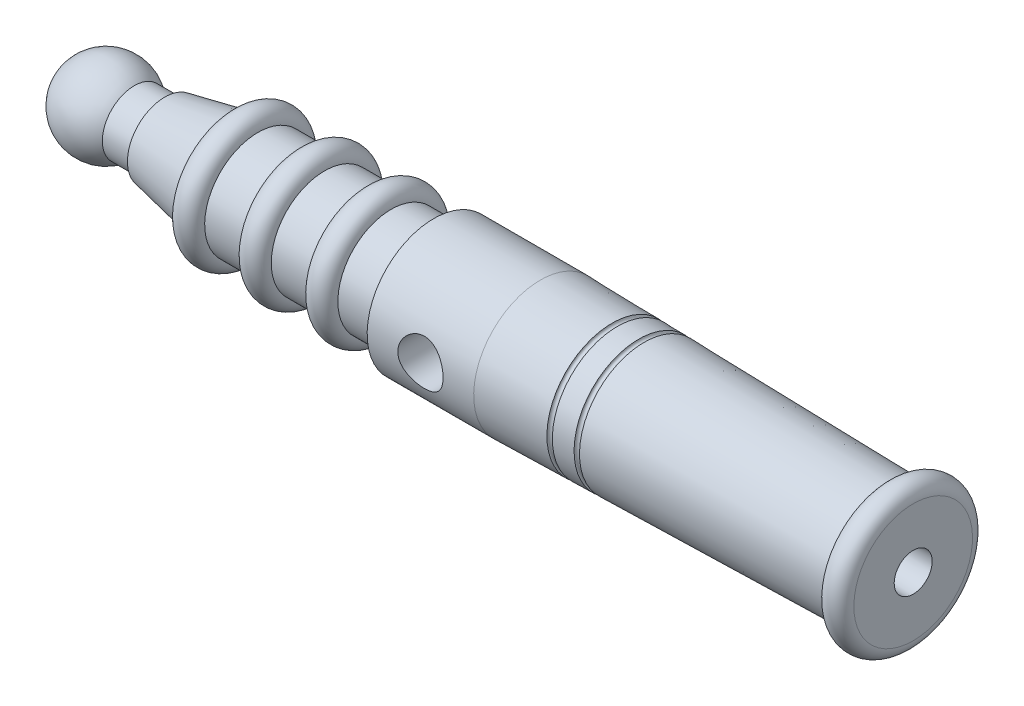
ISO-10303-21;
HEADER;
FILE_DESCRIPTION(('STEP AP214'),'2;1');
FILE_NAME('part.step','',(''),(''),'','','');
FILE_SCHEMA(('AUTOMOTIVE_DESIGN { 1 0 10303 214 1 1 1 1 }'));
ENDSEC;
DATA;
#1=APPLICATION_CONTEXT('core data for automotive mechanical design processes');
#2=APPLICATION_PROTOCOL_DEFINITION('international standard','automotive_design',2000,#1);
#3=PRODUCT_CONTEXT('',#1,'mechanical');
#4=PRODUCT('Part','Part','',(#3));
#5=PRODUCT_RELATED_PRODUCT_CATEGORY('part','',(#4));
#6=PRODUCT_DEFINITION_FORMATION('','',#4);
#7=PRODUCT_DEFINITION_CONTEXT('part definition',#1,'design');
#8=PRODUCT_DEFINITION('design','',#6,#7);
#9=PRODUCT_DEFINITION_SHAPE('','',#8);
#10=(LENGTH_UNIT() NAMED_UNIT(*) SI_UNIT(.MILLI.,.METRE.));
#11=(NAMED_UNIT(*) PLANE_ANGLE_UNIT() SI_UNIT($,.RADIAN.));
#12=(NAMED_UNIT(*) SI_UNIT($,.STERADIAN.) SOLID_ANGLE_UNIT());
#13=UNCERTAINTY_MEASURE_WITH_UNIT(LENGTH_MEASURE(1.E-05),#10,'distance_accuracy_value','');
#14=(GEOMETRIC_REPRESENTATION_CONTEXT(3) GLOBAL_UNCERTAINTY_ASSIGNED_CONTEXT((#13)) GLOBAL_UNIT_ASSIGNED_CONTEXT((#10,
#11,#12)) REPRESENTATION_CONTEXT('',''));
#15=CARTESIAN_POINT('',(0.,0.,0.));
#16=DIRECTION('',(0.,0.,1.));
#17=DIRECTION('',(1.,0.,0.));
#18=AXIS2_PLACEMENT_3D('',#15,#16,#17);
#19=CARTESIAN_POINT('',(8.00000001496646,-1.64793825218866E-09,0.));
#20=DIRECTION('',(-1.,0.,0.));
#21=DIRECTION('',(0.,1.,0.));
#22=AXIS2_PLACEMENT_3D('',#19,#20,#21);
#23=SPHERICAL_SURFACE('',#22,8.);
#24=CARTESIAN_POINT('',(13.2915026364376,-1.06761837156567E-09,0.));
#25=DIRECTION('',(-1.,0.,0.));
#26=DIRECTION('',(0.,-1.,0.));
#27=AXIS2_PLACEMENT_3D('',#24,#25,#26);
#28=CIRCLE('',#27,6.);
#29=CARTESIAN_POINT('',(13.2915026364376,-6.00000000106762,0.));
#30=VERTEX_POINT('',#29);
#31=EDGE_CURVE('E10',#30,#30,#28,.T.);
#32=ORIENTED_EDGE('',*,*,#31,.T.);
#33=EDGE_LOOP('',(#32));
#34=FACE_BOUND('',#33,.T.);
#35=ADVANCED_FACE('F41',(#34),#23,.T.);
#36=CARTESIAN_POINT('',(1.4966462097421E-08,-1.06761995077864E-09,0.));
#37=DIRECTION('',(-1.,0.,0.));
#38=DIRECTION('',(0.,-1.,0.));
#39=AXIS2_PLACEMENT_3D('',#36,#37,#38);
#40=CYLINDRICAL_SURFACE('',#39,6.);
#41=ORIENTED_EDGE('',*,*,#31,.F.);
#42=EDGE_LOOP('',(#41));
#43=FACE_BOUND('',#42,.T.);
#44=CARTESIAN_POINT('',(19.0000000149665,-1.06761769331781E-09,0.));
#45=DIRECTION('',(-1.,0.,0.));
#46=DIRECTION('',(0.,-1.,0.));
#47=AXIS2_PLACEMENT_3D('',#44,#45,#46);
#48=CIRCLE('',#47,6.);
#49=CARTESIAN_POINT('',(19.0000000149665,-6.00000000106762,0.));
#50=VERTEX_POINT('',#49);
#51=EDGE_CURVE('E54',#50,#50,#48,.T.);
#52=ORIENTED_EDGE('',*,*,#51,.T.);
#53=EDGE_LOOP('',(#52));
#54=FACE_BOUND('',#53,.T.);
#55=ADVANCED_FACE('F121',(#43,#54),#40,.T.);
#56=CARTESIAN_POINT('',(19.0000000149665,5.99999999893238,0.));
#57=DIRECTION('',(1.,0.,0.));
#58=DIRECTION('',(0.,1.,0.));
#59=AXIS2_PLACEMENT_3D('',#56,#57,#58);
#60=PLANE('',#59);
#61=ORIENTED_EDGE('',*,*,#51,.F.);
#62=EDGE_LOOP('',(#61));
#63=FACE_BOUND('',#62,.T.);
#64=CARTESIAN_POINT('',(19.0000000149665,-1.06761769331781E-09,0.));
#65=DIRECTION('',(-1.,0.,0.));
#66=DIRECTION('',(0.,-1.,0.));
#67=AXIS2_PLACEMENT_3D('',#64,#65,#66);
#68=CIRCLE('',#67,7.);
#69=CARTESIAN_POINT('',(19.0000000149665,-7.00000000106762,0.));
#70=VERTEX_POINT('',#69);
#71=EDGE_CURVE('E60',#70,#70,#68,.T.);
#72=ORIENTED_EDGE('',*,*,#71,.T.);
#73=EDGE_LOOP('',(#72));
#74=FACE_BOUND('',#73,.T.);
#75=ADVANCED_FACE('F125',(#63,#74),#60,.F.);
#76=CARTESIAN_POINT('',(31.5485483257209,-1.067616202378E-09,0.));
#77=DIRECTION('',(1.,0.,0.));
#78=DIRECTION('',(0.,1.,0.));
#79=AXIS2_PLACEMENT_3D('',#76,#77,#78);
#80=CONICAL_SURFACE('',#79,9.50970966166541,0.19739555981268);
#81=ORIENTED_EDGE('',*,*,#71,.F.);
#82=EDGE_LOOP('',(#81));
#83=FACE_BOUND('',#82,.T.);
#84=CARTESIAN_POINT('',(31.5485483257209,-1.067616202378E-09,0.));
#85=DIRECTION('',(-1.,0.,0.));
#86=DIRECTION('',(0.,-1.,0.));
#87=AXIS2_PLACEMENT_3D('',#84,#85,#86);
#88=CIRCLE('',#87,9.50970966166541);
#89=CARTESIAN_POINT('',(31.5485483257209,-9.50970966273302,0.));
#90=VERTEX_POINT('',#89);
#91=EDGE_CURVE('E204',#90,#90,#88,.T.);
#92=ORIENTED_EDGE('',*,*,#91,.T.);
#93=EDGE_LOOP('',(#92));
#94=FACE_BOUND('',#93,.T.);
#95=ADVANCED_FACE('F130',(#83,#94),#80,.T.);
#96=CARTESIAN_POINT('',(34.0000000149665,-1.06761648133169E-09,0.));
#97=DIRECTION('',(-1.,0.,0.));
#98=DIRECTION('',(0.,-1.,0.));
#99=AXIS2_PLACEMENT_3D('',#96,#97,#98);
#100=TOROIDAL_SURFACE('',#99,9.99999999941967,2.5);
#101=ORIENTED_EDGE('',*,*,#91,.F.);
#102=EDGE_LOOP('',(#101));
#103=FACE_BOUND('',#102,.T.);
#104=CARTESIAN_POINT('',(36.5000000149664,-1.06761561407757E-09,0.));
#105=DIRECTION('',(-1.,0.,0.));
#106=DIRECTION('',(0.,-1.,0.));
#107=AXIS2_PLACEMENT_3D('',#104,#105,#106);
#108=CIRCLE('',#107,9.99999999941967);
#109=CARTESIAN_POINT('',(36.5000000149664,-10.0000000004873,0.));
#110=VERTEX_POINT('',#109);
#111=EDGE_CURVE('E200',#110,#110,#108,.T.);
#112=ORIENTED_EDGE('',*,*,#111,.T.);
#113=EDGE_LOOP('',(#112));
#114=FACE_BOUND('',#113,.T.);
#115=ADVANCED_FACE('F137',(#103,#114),#100,.T.);
#116=CARTESIAN_POINT('',(1.4966462097421E-08,-1.06761995077864E-09,0.));
#117=DIRECTION('',(-1.,0.,0.));
#118=DIRECTION('',(0.,-1.,0.));
#119=AXIS2_PLACEMENT_3D('',#116,#117,#118);
#120=CYLINDRICAL_SURFACE('',#119,9.99999999941967);
#121=ORIENTED_EDGE('',*,*,#111,.F.);
#122=EDGE_LOOP('',(#121));
#123=FACE_BOUND('',#122,.T.);
#124=CARTESIAN_POINT('',(44.0000000149665,-1.06761472297461E-09,0.));
#125=DIRECTION('',(-1.,0.,0.));
#126=DIRECTION('',(0.,-1.,0.));
#127=AXIS2_PLACEMENT_3D('',#124,#125,#126);
#128=CIRCLE('',#127,9.99999999941967);
#129=CARTESIAN_POINT('',(44.0000000149665,-10.0000000004873,0.));
#130=VERTEX_POINT('',#129);
#131=EDGE_CURVE('E196',#130,#130,#128,.T.);
#132=ORIENTED_EDGE('',*,*,#131,.T.);
#133=EDGE_LOOP('',(#132));
#134=FACE_BOUND('',#133,.T.);
#135=ADVANCED_FACE('F141',(#123,#134),#120,.T.);
#136=CARTESIAN_POINT('',(46.5000000149665,-1.06761474660821E-09,0.));
#137=DIRECTION('',(-1.,0.,0.));
#138=DIRECTION('',(0.,-1.,0.));
#139=AXIS2_PLACEMENT_3D('',#136,#137,#138);
#140=TOROIDAL_SURFACE('',#139,9.99999999983092,2.5);
#141=ORIENTED_EDGE('',*,*,#131,.F.);
#142=EDGE_LOOP('',(#141));
#143=FACE_BOUND('',#142,.T.);
#144=CARTESIAN_POINT('',(49.0000000149664,-1.06761412890597E-09,0.));
#145=DIRECTION('',(-1.,0.,0.));
#146=DIRECTION('',(0.,-1.,0.));
#147=AXIS2_PLACEMENT_3D('',#144,#145,#146);
#148=CIRCLE('',#147,9.99999999983092);
#149=CARTESIAN_POINT('',(49.0000000149664,-10.0000000008985,0.));
#150=VERTEX_POINT('',#149);
#151=EDGE_CURVE('E192',#150,#150,#148,.T.);
#152=ORIENTED_EDGE('',*,*,#151,.T.);
#153=EDGE_LOOP('',(#152));
#154=FACE_BOUND('',#153,.T.);
#155=ADVANCED_FACE('F145',(#143,#154),#140,.T.);
#156=CARTESIAN_POINT('',(1.4966462097421E-08,-1.06761995077864E-09,0.));
#157=DIRECTION('',(-1.,0.,0.));
#158=DIRECTION('',(0.,-1.,0.));
#159=AXIS2_PLACEMENT_3D('',#156,#157,#158);
#160=CYLINDRICAL_SURFACE('',#159,9.99999999970983);
#161=ORIENTED_EDGE('',*,*,#151,.F.);
#162=EDGE_LOOP('',(#161));
#163=FACE_BOUND('',#162,.T.);
#164=CARTESIAN_POINT('',(56.5000000149665,-1.06761323780301E-09,0.));
#165=DIRECTION('',(-1.,0.,0.));
#166=DIRECTION('',(0.,-1.,0.));
#167=AXIS2_PLACEMENT_3D('',#164,#165,#166);
#168=CIRCLE('',#167,9.99999999958873);
#169=CARTESIAN_POINT('',(56.5000000149665,-10.0000000006563,0.));
#170=VERTEX_POINT('',#169);
#171=EDGE_CURVE('E188',#170,#170,#168,.T.);
#172=ORIENTED_EDGE('',*,*,#171,.T.);
#173=EDGE_LOOP('',(#172));
#174=FACE_BOUND('',#173,.T.);
#175=ADVANCED_FACE('F149',(#163,#174),#160,.T.);
#176=CARTESIAN_POINT('',(59.0000000149664,-1.06761301188474E-09,0.));
#177=DIRECTION('',(-1.,0.,0.));
#178=DIRECTION('',(0.,-1.,0.));
#179=AXIS2_PLACEMENT_3D('',#176,#177,#178);
#180=TOROIDAL_SURFACE('',#179,9.99999999979437,2.5);
#181=ORIENTED_EDGE('',*,*,#171,.F.);
#182=EDGE_LOOP('',(#181));
#183=FACE_BOUND('',#182,.T.);
#184=CARTESIAN_POINT('',(61.5000000149664,-1.06761264373437E-09,0.));
#185=DIRECTION('',(-1.,0.,0.));
#186=DIRECTION('',(0.,-1.,0.));
#187=AXIS2_PLACEMENT_3D('',#184,#185,#186);
#188=CIRCLE('',#187,10.);
#189=CARTESIAN_POINT('',(61.5000000149664,-10.0000000010676,0.));
#190=VERTEX_POINT('',#189);
#191=EDGE_CURVE('E178',#190,#190,#188,.T.);
#192=ORIENTED_EDGE('',*,*,#191,.T.);
#193=EDGE_LOOP('',(#192));
#194=FACE_BOUND('',#193,.T.);
#195=ADVANCED_FACE('F153',(#183,#194),#180,.T.);
#196=CARTESIAN_POINT('',(1.4966462097421E-08,-1.06761995077864E-09,0.));
#197=DIRECTION('',(-1.,0.,0.));
#198=DIRECTION('',(0.,-1.,0.));
#199=AXIS2_PLACEMENT_3D('',#196,#197,#198);
#200=CYLINDRICAL_SURFACE('',#199,10.);
#201=ORIENTED_EDGE('',*,*,#191,.F.);
#202=EDGE_LOOP('',(#201));
#203=FACE_BOUND('',#202,.T.);
#204=CARTESIAN_POINT('',(69.5000000149664,-1.06761169322455E-09,0.));
#205=DIRECTION('',(-1.,0.,0.));
#206=DIRECTION('',(0.,-1.,0.));
#207=AXIS2_PLACEMENT_3D('',#204,#205,#206);
#208=CIRCLE('',#207,10.);
#209=CARTESIAN_POINT('',(69.5000000149664,-10.0000000010676,0.));
#210=VERTEX_POINT('',#209);
#211=EDGE_CURVE('E168',#210,#210,#208,.T.);
#212=ORIENTED_EDGE('',*,*,#211,.T.);
#213=EDGE_LOOP('',(#212));
#214=FACE_BOUND('',#213,.T.);
#215=ADVANCED_FACE('F157',(#203,#214),#200,.T.);
#216=CARTESIAN_POINT('',(69.500000014281,12.4999999989324,0.));
#217=DIRECTION('',(1.,0.,0.));
#218=DIRECTION('',(0.,1.,0.));
#219=AXIS2_PLACEMENT_3D('',#216,#217,#218);
#220=PLANE('',#219);
#221=ORIENTED_EDGE('',*,*,#211,.F.);
#222=EDGE_LOOP('',(#221));
#223=FACE_BOUND('',#222,.T.);
#224=CARTESIAN_POINT('',(69.5000000135956,-1.06761169322455E-09,0.));
#225=DIRECTION('',(-1.,0.,0.));
#226=DIRECTION('',(0.,-1.,0.));
#227=AXIS2_PLACEMENT_3D('',#224,#225,#226);
#228=CIRCLE('',#227,12.5);
#229=CARTESIAN_POINT('',(69.5000000135956,-12.5000000010676,0.));
#230=VERTEX_POINT('',#229);
#231=EDGE_CURVE('E171',#230,#230,#228,.T.);
#232=ORIENTED_EDGE('',*,*,#231,.T.);
#233=EDGE_LOOP('',(#232));
#234=FACE_BOUND('',#233,.T.);
#235=ADVANCED_FACE('F116',(#223,#234),#220,.F.);
#236=CARTESIAN_POINT('',(1.4966462097421E-08,-1.06761995077864E-09,0.));
#237=DIRECTION('',(-1.,0.,0.));
#238=DIRECTION('',(0.,-1.,0.));
#239=AXIS2_PLACEMENT_3D('',#236,#237,#238);
#240=CYLINDRICAL_SURFACE('',#239,12.5);
#241=CARTESIAN_POINT('',(83.7500000135956,0.,-12.5));
#242=CARTESIAN_POINT('',(83.7500020466297,0.231629316589648,-12.5000013493433));
#243=CARTESIAN_POINT('',(83.7310026806411,0.463244602267327,-12.4935028687472));
#244=CARTESIAN_POINT('',(83.6557510645229,0.919637198745953,-12.4682205879007));
#245=CARTESIAN_POINT('',(83.5994964248404,1.14441406996376,-12.4494359996204));
#246=CARTESIAN_POINT('',(83.4518965515942,1.58048439725015,-12.4016188731915));
#247=CARTESIAN_POINT('',(83.3606113918741,1.79180021824834,-12.3726038860342));
#248=CARTESIAN_POINT('',(83.1458184947685,2.19612039000668,-12.3072763655836));
#249=CARTESIAN_POINT('',(83.0223040067324,2.38912089293685,-12.2709623038164));
#250=CARTESIAN_POINT('',(82.7419107054756,2.75825261946891,-12.1933910282706));
#251=CARTESIAN_POINT('',(82.5840824556957,2.9336368812417,-12.1520119723071));
#252=CARTESIAN_POINT('',(82.2415597144834,3.25602333803433,-12.0696334377321));
#253=CARTESIAN_POINT('',(82.0568589996246,3.40301894008669,-12.0286340493941));
#254=CARTESIAN_POINT('',(81.6590227341569,3.66879190778827,-11.9503048628702));
#255=CARTESIAN_POINT('',(81.4451980840698,3.78658554366087,-11.9131228608371));
#256=CARTESIAN_POINT('',(80.99930535291,3.98421855182862,-11.848497532343));
#257=CARTESIAN_POINT('',(80.7672431244954,4.06407004272088,-11.8210510970846));
#258=CARTESIAN_POINT('',(80.2999754807984,4.18072715856811,-11.7802904135072));
#259=CARTESIAN_POINT('',(80.065161873679,4.21893677154744,-11.7665167251183));
#260=CARTESIAN_POINT('',(79.5920835068675,4.25561504969276,-11.7533040941214));
#261=CARTESIAN_POINT('',(79.3538198901967,4.25409658909759,-11.7538605077145));
#262=CARTESIAN_POINT('',(78.8927050677144,4.2124493402418,-11.7688435664026));
#263=CARTESIAN_POINT('',(78.6696615097062,4.17416942037125,-11.7826060058833));
#264=CARTESIAN_POINT('',(78.2333745260433,4.06310816523024,-11.821360989808));
#265=CARTESIAN_POINT('',(78.0201323219175,3.99032254228357,-11.8463549298573));
#266=CARTESIAN_POINT('',(77.6053676423729,3.81113653039249,-11.9052184285008));
#267=CARTESIAN_POINT('',(77.4040979850364,3.70419900732722,-11.9392282250551));
#268=CARTESIAN_POINT('',(77.0217829397335,3.4601177399932,-12.0122344754999));
#269=CARTESIAN_POINT('',(76.8407436048101,3.32296499141455,-12.0512324144293));
#270=CARTESIAN_POINT('',(76.4936615033317,3.01353124217079,-12.1324166413506));
#271=CARTESIAN_POINT('',(76.3289723700731,2.83974395037662,-12.1746609038703));
#272=CARTESIAN_POINT('',(76.0307146858697,2.46650176994396,-12.2557250186689));
#273=CARTESIAN_POINT('',(75.8971493658911,2.26704421980664,-12.2945445151628));
#274=CARTESIAN_POINT('',(75.6637817336343,1.84516436756343,-12.3649312354625));
#275=CARTESIAN_POINT('',(75.5643554518305,1.62251944689814,-12.3964165315147));
#276=CARTESIAN_POINT('',(75.4047926425132,1.16233553496176,-12.4479909439323));
#277=CARTESIAN_POINT('',(75.3446418910162,0.924801969941704,-12.4680841856843));
#278=CARTESIAN_POINT('',(75.2677666656181,0.4530328069533,-12.493920688343));
#279=CARTESIAN_POINT('',(75.2492140971138,0.219127772364907,-12.5002675966001));
#280=CARTESIAN_POINT('',(75.250836706931,-0.248508234283628,-12.4997151393861));
#281=CARTESIAN_POINT('',(75.2710050477117,-0.482239229785451,-12.4928181125983));
#282=CARTESIAN_POINT('',(75.3480582475645,-0.935487055941745,-12.4669514589975));
#283=CARTESIAN_POINT('',(75.4038095593681,-1.15521999199594,-12.4483547938527));
#284=CARTESIAN_POINT('',(75.549017471433,-1.58211571476596,-12.4013331972761));
#285=CARTESIAN_POINT('',(75.6384783998685,-1.78927688335188,-12.3729070038124));
#286=CARTESIAN_POINT('',(75.8512234673925,-2.19135854366338,-12.308149954922));
#287=CARTESIAN_POINT('',(75.9753519042485,-2.3858005114654,-12.2716272119705));
#288=CARTESIAN_POINT('',(76.2529228984011,-2.75168306553666,-12.1948041288894));
#289=CARTESIAN_POINT('',(76.4063747241339,-2.92311635005654,-12.1545025964298));
#290=CARTESIAN_POINT('',(76.7468275801094,-3.24657351289177,-12.0722386135219));
#291=CARTESIAN_POINT('',(76.9350735015074,-3.39729328843604,-12.030287918506));
#292=CARTESIAN_POINT('',(77.3350778916012,-3.66518020874318,-11.9514023500184));
#293=CARTESIAN_POINT('',(77.546836787779,-3.78234674334645,-11.9144675677666));
#294=CARTESIAN_POINT('',(77.98815669389,-3.97933669538489,-11.8501336298304));
#295=CARTESIAN_POINT('',(78.2176946598753,-4.0592075388895,-11.8227223752284));
#296=CARTESIAN_POINT('',(78.6881175808713,-4.17877629044564,-11.7809981447787));
#297=CARTESIAN_POINT('',(78.9289970912208,-4.21849327320159,-11.7666789499836));
#298=CARTESIAN_POINT('',(79.4014252837596,-4.25510290219737,-11.7534862513917));
#299=CARTESIAN_POINT('',(79.6327854642358,-4.25416884330729,-11.7538288768874));
#300=CARTESIAN_POINT('',(80.0918665812423,-4.21488538095175,-11.7679720869845));
#301=CARTESIAN_POINT('',(80.3195877504834,-4.17653837981466,-11.7817718074901));
#302=CARTESIAN_POINT('',(80.7602486835291,-4.06508169516293,-11.8206793928908));
#303=CARTESIAN_POINT('',(80.9733961522885,-3.99270334548984,-11.8455487972133));
#304=CARTESIAN_POINT('',(81.3846811826349,-3.81583792724868,-11.9036971536875));
#305=CARTESIAN_POINT('',(81.5828153170717,-3.71134355479568,-11.9369780184829));
#306=CARTESIAN_POINT('',(81.9681337185136,-3.46772073519873,-12.0100690472769));
#307=CARTESIAN_POINT('',(82.1544218881092,-3.32724348867709,-12.0501058974223));
#308=CARTESIAN_POINT('',(82.501482004673,-3.01789256009473,-12.1312763734598));
#309=CARTESIAN_POINT('',(82.6622465755321,-2.84901069826784,-12.1724103124048));
#310=CARTESIAN_POINT('',(82.9603796587307,-2.47930158784587,-12.2531734331998));
#311=CARTESIAN_POINT('',(83.096512566661,-2.2774454475436,-12.2926709571087));
#312=CARTESIAN_POINT('',(83.3327805362352,-1.85239769834017,-12.3638575019423));
#313=CARTESIAN_POINT('',(83.4329230806857,-1.62921053663156,-12.3955481455748));
#314=CARTESIAN_POINT('',(83.5911995602113,-1.17498554096683,-12.4466848306276));
#315=CARTESIAN_POINT('',(83.6505523625293,-0.944413374422518,-12.4664836858276));
#316=CARTESIAN_POINT('',(83.7299455563356,-0.4758876892136,-12.4931386058322));
#317=CARTESIAN_POINT('',(83.7499979252031,-0.237936441896084,-12.4999986139149));
#318=CARTESIAN_POINT('',(83.7500000135956,0.,-12.5));
#319=B_SPLINE_CURVE_WITH_KNOTS('',3,(#241,#242,#243,#244,#245,#246,#247,#248,#249,#250,#251,
#252,#253,#254,#255,#256,#257,#258,#259,#260,#261,#262,#263,#264,#265,#266,#267,#268,#269,#270,
#271,#272,#273,#274,#275,#276,#277,#278,#279,#280,#281,#282,#283,#284,#285,#286,#287,#288,#289,
#290,#291,#292,#293,#294,#295,#296,#297,#298,#299,#300,#301,#302,#303,#304,#305,#306,#307,#308,
#309,#310,#311,#312,#313,#314,#315,#316,#317,#318),.UNSPECIFIED.,.T.,.F.,(4,2,2,2,2,2,2,2,2,2,2,
2,2,2,2,2,2,2,2,2,2,2,2,2,2,2,2,2,2,2,2,2,2,2,2,2,2,2,4),(0.,0.694012031147097,1.38806858052906,
2.08094017311267,2.7739570089891,3.48937549751481,4.20495993518284,4.94210626795908,
5.67901700008019,6.39023024991974,7.10121302757765,7.77821403361305,8.45529918580411,
9.14360628255765,9.83211877689635,10.5581272082996,11.2842109731703,12.0180534127754,
12.7516299371721,13.4522781500001,14.1528026500786,14.832054720965,15.5113940347207,
16.2089885680866,16.9068039605443,17.6376748124527,18.3685589542713,19.0985111386279,
19.8281164030749,20.5187658396559,21.2093709317548,21.8857695189702,22.5623220479636,
23.2693695245394,23.976620961508,24.7129879657083,25.4492017821263,26.1623287080919,
26.8752382644273),.UNSPECIFIED.);
#320=CARTESIAN_POINT('',(83.7500000135956,0.,-12.5));
#321=VERTEX_POINT('',#320);
#322=EDGE_CURVE('E44',#321,#321,#319,.T.);
#323=ORIENTED_EDGE('',*,*,#322,.T.);
#324=EDGE_LOOP('',(#323));
#325=FACE_BOUND('',#324,.T.);
#326=CARTESIAN_POINT('',(83.7500000135956,0.,12.5));
#327=CARTESIAN_POINT('',(83.7500020466297,-0.231629316581947,12.5000013493828));
#328=CARTESIAN_POINT('',(83.7310026806424,-0.463244602252988,12.4935028688268));
#329=CARTESIAN_POINT('',(83.6557510645281,-0.919637198720835,12.4682205880599));
#330=CARTESIAN_POINT('',(83.5994964248483,-1.1444140699345,12.4494359998192));
#331=CARTESIAN_POINT('',(83.451896551608,-1.58048439721514,12.401618873468));
#332=CARTESIAN_POINT('',(83.360611391891,-1.79180021821169,12.3726038863486));
#333=CARTESIAN_POINT('',(83.1458184947916,-2.19612038996812,12.3072763659714));
#334=CARTESIAN_POINT('',(83.0223040067586,-2.38912089289802,12.2709623042396));
#335=CARTESIAN_POINT('',(82.7419107055118,-2.75825261942577,12.1933910287632));
#336=CARTESIAN_POINT('',(82.5840824557393,-2.93363688119513,12.1520119728337));
#337=CARTESIAN_POINT('',(82.2415597145442,-3.25602333798258,12.0696334383219));
#338=CARTESIAN_POINT('',(82.0568589996949,-3.4030189400332,12.0286340500133));
#339=CARTESIAN_POINT('',(81.6590227342463,-3.66879190773522,11.950304863542));
#340=CARTESIAN_POINT('',(81.4451980841685,-3.78658554360962,11.9131228615321));
#341=CARTESIAN_POINT('',(80.999305353029,-3.98421855178334,11.8484975330762));
#342=CARTESIAN_POINT('',(80.7672431246255,-4.06407004267975,11.8210510978328));
#343=CARTESIAN_POINT('',(80.2999754809369,-4.18072715854189,11.7802904142743));
#344=CARTESIAN_POINT('',(80.0651618738143,-4.21893677152955,11.7665167258903));
#345=CARTESIAN_POINT('',(79.5920835069953,-4.25561504969024,11.7533040948955));
#346=CARTESIAN_POINT('',(79.3538198903202,-4.25409658910209,11.7538605084856));
#347=CARTESIAN_POINT('',(78.8927050678178,-4.21244934025748,11.7688435671612));
#348=CARTESIAN_POINT('',(78.6696615097941,-4.17416942038956,11.7826060066333));
#349=CARTESIAN_POINT('',(78.2333745260997,-4.06310816524867,11.8213609905356));
#350=CARTESIAN_POINT('',(78.0201323219579,-3.99032254229949,11.8463549305712));
#351=CARTESIAN_POINT('',(77.6053676423859,-3.81113653039968,11.9052184291821));
#352=CARTESIAN_POINT('',(77.4040979850376,-3.70419900732874,11.9392282257171));
#353=CARTESIAN_POINT('',(77.0217829397125,-3.46011773997908,12.012234476119));
#354=CARTESIAN_POINT('',(76.8407436047788,-3.32296499139046,12.0512324150248));
#355=CARTESIAN_POINT('',(76.4936615032915,-3.01353124213085,12.1324166418908));
#356=CARTESIAN_POINT('',(76.3289723700331,-2.83974395033221,12.1746609043786));
#357=CARTESIAN_POINT('',(76.0307146858313,-2.46650176989023,12.2557250191094));
#358=CARTESIAN_POINT('',(75.897149365854,-2.26704421974806,12.2945445155673));
#359=CARTESIAN_POINT('',(75.6637817336067,-1.845164367505,12.3649312357897));
#360=CARTESIAN_POINT('',(75.5643554518094,-1.62251944684561,12.3964165318008));
#361=CARTESIAN_POINT('',(75.4047926425031,-1.16233553492415,12.447990944135));
#362=CARTESIAN_POINT('',(75.3446418910105,-0.924801969913117,12.4680841858445));
#363=CARTESIAN_POINT('',(75.2677666656176,-0.453032806943932,12.4939206884206));
#364=CARTESIAN_POINT('',(75.2492140971144,-0.219127772365551,12.5002675966373));
#365=CARTESIAN_POINT('',(75.2508367069303,0.248508234260825,12.4997151393439));
#366=CARTESIAN_POINT('',(75.2710050477085,0.482239229750499,12.492818112517));
#367=CARTESIAN_POINT('',(75.3480582475535,0.935487055892292,12.466951458841));
#368=CARTESIAN_POINT('',(75.4038095593536,1.15521999194384,12.4483547936594));
#369=CARTESIAN_POINT('',(75.54901747141,1.58211571470816,12.4013331970111));
#370=CARTESIAN_POINT('',(75.6384783998406,1.78927688329101,12.3729070035124));
#371=CARTESIAN_POINT('',(75.8512234673574,2.19135854360548,12.3081499545523));
#372=CARTESIAN_POINT('',(75.9753519042126,2.3858005114128,12.2716272115658));
#373=CARTESIAN_POINT('',(76.2529228983649,2.75168306549427,12.1948041284174));
#374=CARTESIAN_POINT('',(76.4063747240982,2.92311635001907,12.1545025959255));
#375=CARTESIAN_POINT('',(76.7468275800787,3.24657351286631,12.0722386129547));
#376=CARTESIAN_POINT('',(76.9350735014817,3.39729328841728,12.0302879179084));
#377=CARTESIAN_POINT('',(77.3350778915886,3.66518020873633,11.9514023493658));
#378=CARTESIAN_POINT('',(77.5468367877745,3.78234674334482,11.9144675670894));
#379=CARTESIAN_POINT('',(77.9881566938973,3.97933669538781,11.8501336291124));
#380=CARTESIAN_POINT('',(78.2176946598857,4.05920753889303,11.8227223744941));
#381=CARTESIAN_POINT('',(78.6881175808893,4.17877629044935,11.78099814402));
#382=CARTESIAN_POINT('',(78.9289970912434,4.2184932732049,11.7666789492169));
#383=CARTESIAN_POINT('',(79.401425283777,4.25510290219724,11.7534862506187));
#384=CARTESIAN_POINT('',(79.6327854642433,4.25416884330652,11.7538288761149));
#385=CARTESIAN_POINT('',(80.0918665812297,4.21488538095296,11.7679720862193));
#386=CARTESIAN_POINT('',(80.3195877504608,4.1765383798185,11.7817718067319));
#387=CARTESIAN_POINT('',(80.7602486834825,4.06508169517656,11.8206793921519));
#388=CARTESIAN_POINT('',(80.9733961522282,3.9927033455112,11.8455487964863));
#389=CARTESIAN_POINT('',(81.3846811825485,3.81583792729041,11.9036971529896));
#390=CARTESIAN_POINT('',(81.582815316973,3.71134355485004,11.9369780178021));
#391=CARTESIAN_POINT('',(81.9681337184001,3.46772073527891,12.0100690466372));
#392=CARTESIAN_POINT('',(82.1544218879926,3.32724348876943,12.0501058968071));
#393=CARTESIAN_POINT('',(82.5014820045526,3.01789256021369,12.131276372899));
#394=CARTESIAN_POINT('',(82.6622465754111,2.84901069840125,12.1724103118737));
#395=CARTESIAN_POINT('',(82.9603796586211,2.47930158799915,12.2531734327368));
#396=CARTESIAN_POINT('',(83.0965125665617,2.27744544770082,12.2926709566841));
#397=CARTESIAN_POINT('',(83.3327805361569,1.85239769850256,12.3638575015981));
#398=CARTESIAN_POINT('',(83.4329230806182,1.62921053679517,12.3955481452727));
#399=CARTESIAN_POINT('',(83.5911995601723,1.17498554110778,12.4466848304132));
#400=CARTESIAN_POINT('',(83.6505523625046,0.944413374538375,12.4664836856576));
#401=CARTESIAN_POINT('',(83.7299455563303,0.475887689274478,12.4931386057491));
#402=CARTESIAN_POINT('',(83.7499979252031,0.237936441927082,12.4999986138743));
#403=CARTESIAN_POINT('',(83.7500000135956,0.,12.5));
#404=B_SPLINE_CURVE_WITH_KNOTS('',3,(#326,#327,#328,#329,#330,#331,#332,#333,#334,#335,#336,
#337,#338,#339,#340,#341,#342,#343,#344,#345,#346,#347,#348,#349,#350,#351,#352,#353,#354,#355,
#356,#357,#358,#359,#360,#361,#362,#363,#364,#365,#366,#367,#368,#369,#370,#371,#372,#373,#374,
#375,#376,#377,#378,#379,#380,#381,#382,#383,#384,#385,#386,#387,#388,#389,#390,#391,#392,#393,
#394,#395,#396,#397,#398,#399,#400,#401,#402,#403),.UNSPECIFIED.,.T.,.F.,(4,2,2,2,2,2,2,2,2,2,2,
2,2,2,2,2,2,2,2,2,2,2,2,2,2,2,2,2,2,2,2,2,2,2,2,2,2,2,4),(0.,0.694012031123947,1.38806858048239,
2.08094017304361,2.77395700889766,3.48937549738348,4.20495993501155,4.94210626775619,
5.67901699984612,6.39023024969857,7.10121302736957,7.77821403344757,8.4552991856812,
9.1436062824646,9.83211877683303,10.5581272082286,11.2842109730914,12.018053412657,
12.7516299370142,13.4522781498091,14.1528026498548,14.8320547207402,15.5113940344951,
16.2089885678892,16.9068039603754,17.637674812323,18.3685589541807,19.0985111385517,
19.8281164030125,20.5187658395638,21.2093709316329,21.8857695188064,22.562322047758,
23.2693695243174,23.97662096127,24.7129879654961,25.4492017819403,26.162328707999,
26.8752382644273),.UNSPECIFIED.);
#405=CARTESIAN_POINT('',(83.7500000135956,0.,12.5));
#406=VERTEX_POINT('',#405);
#407=EDGE_CURVE('E63',#406,#406,#404,.T.);
#408=ORIENTED_EDGE('',*,*,#407,.T.);
#409=EDGE_LOOP('',(#408));
#410=FACE_BOUND('',#409,.T.);
#411=ORIENTED_EDGE('',*,*,#231,.F.);
#412=EDGE_LOOP('',(#411));
#413=FACE_BOUND('',#412,.T.);
#414=CARTESIAN_POINT('',(89.5000000135956,-1.06760931694999E-09,0.));
#415=DIRECTION('',(-1.,0.,0.));
#416=DIRECTION('',(0.,-1.,0.));
#417=AXIS2_PLACEMENT_3D('',#414,#415,#416);
#418=CIRCLE('',#417,12.5);
#419=CARTESIAN_POINT('',(89.5000000135956,-12.5000000010676,0.));
#420=VERTEX_POINT('',#419);
#421=EDGE_CURVE('E174',#420,#420,#418,.T.);
#422=ORIENTED_EDGE('',*,*,#421,.T.);
#423=EDGE_LOOP('',(#422));
#424=FACE_BOUND('',#423,.T.);
#425=ADVANCED_FACE('F69',(#325,#410,#413,#424),#240,.T.);
#426=CARTESIAN_POINT('',(102.970136262379,-1.06760771651288E-09,0.));
#427=DIRECTION('',(-1.,0.,0.));
#428=DIRECTION('',(0.,-1.,0.));
#429=AXIS2_PLACEMENT_3D('',#426,#427,#428);
#430=CONICAL_SURFACE('',#429,12.2286757784608,0.020139925164964);
#431=ORIENTED_EDGE('',*,*,#421,.F.);
#432=EDGE_LOOP('',(#431));
#433=FACE_BOUND('',#432,.T.);
#434=CARTESIAN_POINT('',(102.970136262379,-1.06760771651288E-09,0.));
#435=DIRECTION('',(-1.,0.,0.));
#436=DIRECTION('',(0.,-1.,0.));
#437=AXIS2_PLACEMENT_3D('',#434,#435,#436);
#438=CIRCLE('',#437,12.2286757784608);
#439=CARTESIAN_POINT('',(102.970136262379,-12.2286757795284,0.));
#440=VERTEX_POINT('',#439);
#441=EDGE_CURVE('E181',#440,#440,#438,.T.);
#442=ORIENTED_EDGE('',*,*,#441,.T.);
#443=EDGE_LOOP('',(#442));
#444=FACE_BOUND('',#443,.T.);
#445=ADVANCED_FACE('F109',(#433,#444),#430,.T.);
#446=CARTESIAN_POINT('',(103.469730700632,-1.06760780771431E-09,0.));
#447=DIRECTION('',(-1.,0.,0.));
#448=DIRECTION('',(0.,-1.,0.));
#449=AXIS2_PLACEMENT_3D('',#446,#447,#448);
#450=TOROIDAL_SURFACE('',#449,12.2085412989125,0.499999999999997);
#451=ORIENTED_EDGE('',*,*,#441,.F.);
#452=EDGE_LOOP('',(#451));
#453=FACE_BOUND('',#452,.T.);
#454=CARTESIAN_POINT('',(103.969730700632,-1.06760759774734E-09,0.));
#455=DIRECTION('',(-1.,0.,0.));
#456=DIRECTION('',(0.,-1.,0.));
#457=AXIS2_PLACEMENT_3D('',#454,#455,#456);
#458=CIRCLE('',#457,12.2085412989125);
#459=CARTESIAN_POINT('',(103.969730700632,-12.2085412999801,0.));
#460=VERTEX_POINT('',#459);
#461=EDGE_CURVE('E227',#460,#460,#458,.T.);
#462=ORIENTED_EDGE('',*,*,#461,.T.);
#463=EDGE_LOOP('',(#462));
#464=FACE_BOUND('',#463,.T.);
#465=ADVANCED_FACE('F106',(#453,#464),#450,.F.);
#466=CARTESIAN_POINT('',(107.970136262379,-1.06760712244424E-09,0.));
#467=DIRECTION('',(-1.,0.,0.));
#468=DIRECTION('',(0.,-1.,0.));
#469=AXIS2_PLACEMENT_3D('',#466,#467,#468);
#470=CONICAL_SURFACE('',#469,12.1279625352805,0.0201399251649641);
#471=ORIENTED_EDGE('',*,*,#461,.F.);
#472=EDGE_LOOP('',(#471));
#473=FACE_BOUND('',#472,.T.);
#474=CARTESIAN_POINT('',(107.970136262379,-1.06760712244424E-09,0.));
#475=DIRECTION('',(-1.,0.,0.));
#476=DIRECTION('',(0.,-1.,0.));
#477=AXIS2_PLACEMENT_3D('',#474,#475,#476);
#478=CIRCLE('',#477,12.1279625352805);
#479=CARTESIAN_POINT('',(107.970136262379,-12.1279625363481,0.));
#480=VERTEX_POINT('',#479);
#481=EDGE_CURVE('E231',#480,#480,#478,.T.);
#482=ORIENTED_EDGE('',*,*,#481,.T.);
#483=EDGE_LOOP('',(#482));
#484=FACE_BOUND('',#483,.T.);
#485=ADVANCED_FACE('F102',(#473,#484),#470,.T.);
#486=CARTESIAN_POINT('',(108.469730700632,-1.06760780771431E-09,0.));
#487=DIRECTION('',(-1.,0.,0.));
#488=DIRECTION('',(0.,-1.,0.));
#489=AXIS2_PLACEMENT_3D('',#486,#487,#488);
#490=TOROIDAL_SURFACE('',#489,12.1078280557322,0.499999999999997);
#491=ORIENTED_EDGE('',*,*,#481,.F.);
#492=EDGE_LOOP('',(#491));
#493=FACE_BOUND('',#492,.T.);
#494=CARTESIAN_POINT('',(108.969730700632,-1.0676070036787E-09,0.));
#495=DIRECTION('',(-1.,0.,0.));
#496=DIRECTION('',(0.,-1.,0.));
#497=AXIS2_PLACEMENT_3D('',#494,#495,#496);
#498=CIRCLE('',#497,12.1078280557322);
#499=CARTESIAN_POINT('',(108.969730700632,-12.1078280567998,0.));
#500=VERTEX_POINT('',#499);
#501=EDGE_CURVE('E235',#500,#500,#498,.T.);
#502=ORIENTED_EDGE('',*,*,#501,.T.);
#503=EDGE_LOOP('',(#502));
#504=FACE_BOUND('',#503,.T.);
#505=ADVANCED_FACE('F98',(#493,#504),#490,.F.);
#506=CARTESIAN_POINT('',(154.500000013596,-1.06760159405767E-09,0.));
#507=DIRECTION('',(-1.,0.,0.));
#508=DIRECTION('',(0.,-1.,0.));
#509=AXIS2_PLACEMENT_3D('',#506,#507,#508);
#510=CONICAL_SURFACE('',#509,11.1907278386557,0.0201399251649642);
#511=ORIENTED_EDGE('',*,*,#501,.F.);
#512=EDGE_LOOP('',(#511));
#513=FACE_BOUND('',#512,.T.);
#514=CARTESIAN_POINT('',(154.500000013596,-1.06760159405767E-09,0.));
#515=DIRECTION('',(-1.,0.,0.));
#516=DIRECTION('',(0.,-1.,0.));
#517=AXIS2_PLACEMENT_3D('',#514,#515,#516);
#518=CIRCLE('',#517,11.1907278386557);
#519=CARTESIAN_POINT('',(154.500000013596,-11.1907278397233,0.));
#520=VERTEX_POINT('',#519);
#521=EDGE_CURVE('E239',#520,#520,#518,.T.);
#522=ORIENTED_EDGE('',*,*,#521,.T.);
#523=EDGE_LOOP('',(#522));
#524=FACE_BOUND('',#523,.T.);
#525=ADVANCED_FACE('F94',(#513,#524),#510,.T.);
#526=CARTESIAN_POINT('',(156.999493010001,-1.06760086882041E-09,0.));
#527=DIRECTION('',(-1.,0.,0.));
#528=DIRECTION('',(0.,-1.,0.));
#529=AXIS2_PLACEMENT_3D('',#526,#527,#528);
#530=TOROIDAL_SURFACE('',#529,11.1403814294608,2.5);
#531=ORIENTED_EDGE('',*,*,#521,.F.);
#532=EDGE_LOOP('',(#531));
#533=FACE_BOUND('',#532,.T.);
#534=CARTESIAN_POINT('',(159.499493010001,-1.06760100004927E-09,0.));
#535=DIRECTION('',(-1.,0.,0.));
#536=DIRECTION('',(0.,-1.,0.));
#537=AXIS2_PLACEMENT_3D('',#534,#535,#536);
#538=CIRCLE('',#537,11.1403814294608);
#539=CARTESIAN_POINT('',(159.499493010001,-11.1403814305284,0.));
#540=VERTEX_POINT('',#539);
#541=EDGE_CURVE('E243',#540,#540,#538,.T.);
#542=ORIENTED_EDGE('',*,*,#541,.T.);
#543=EDGE_LOOP('',(#542));
#544=FACE_BOUND('',#543,.T.);
#545=ADVANCED_FACE('F90',(#533,#544),#530,.T.);
#546=CARTESIAN_POINT('',(159.499493010001,3.56376676191731,0.));
#547=DIRECTION('',(-1.,0.,0.));
#548=DIRECTION('',(0.,-1.,0.));
#549=AXIS2_PLACEMENT_3D('',#546,#547,#548);
#550=PLANE('',#549);
#551=ORIENTED_EDGE('',*,*,#541,.F.);
#552=EDGE_LOOP('',(#551));
#553=FACE_BOUND('',#552,.T.);
#554=CARTESIAN_POINT('',(159.499493010001,-1.06760100004927E-09,0.));
#555=DIRECTION('',(-1.,0.,0.));
#556=DIRECTION('',(0.,-1.,0.));
#557=AXIS2_PLACEMENT_3D('',#554,#555,#556);
#558=CIRCLE('',#557,3.56376676298491);
#559=CARTESIAN_POINT('',(159.499493010001,-3.56376676405251,0.));
#560=VERTEX_POINT('',#559);
#561=EDGE_CURVE('E247',#560,#560,#558,.T.);
#562=ORIENTED_EDGE('',*,*,#561,.T.);
#563=EDGE_LOOP('',(#562));
#564=FACE_BOUND('',#563,.T.);
#565=ADVANCED_FACE('F86',(#553,#564),#550,.F.);
#566=CARTESIAN_POINT('',(109.50271734051,-1.06760694035257E-09,0.));
#567=DIRECTION('',(1.,0.,0.));
#568=DIRECTION('',(0.,1.,0.));
#569=AXIS2_PLACEMENT_3D('',#566,#567,#568);
#570=CONICAL_SURFACE('',#569,2.99594403136803,0.0113566987517222);
#571=ORIENTED_EDGE('',*,*,#561,.F.);
#572=EDGE_LOOP('',(#571));
#573=FACE_BOUND('',#572,.T.);
#574=CARTESIAN_POINT('',(109.50271734051,-1.06760694035257E-09,0.));
#575=DIRECTION('',(-1.,0.,0.));
#576=DIRECTION('',(0.,-1.,0.));
#577=AXIS2_PLACEMENT_3D('',#574,#575,#576);
#578=CIRCLE('',#577,2.99594403136803);
#579=CARTESIAN_POINT('',(109.50271734051,-2.99594403243563,0.));
#580=VERTEX_POINT('',#579);
#581=EDGE_CURVE('E251',#580,#580,#578,.T.);
#582=ORIENTED_EDGE('',*,*,#581,.T.);
#583=EDGE_LOOP('',(#582));
#584=FACE_BOUND('',#583,.T.);
#585=ADVANCED_FACE('F82',(#573,#584),#570,.F.);
#586=CARTESIAN_POINT('',(109.50271734051,-1.06760694035257E-09,0.));
#587=DIRECTION('',(-1.,0.,0.));
#588=DIRECTION('',(0.,-1.,0.));
#589=AXIS2_PLACEMENT_3D('',#586,#587,#588);
#590=PLANE('',#589);
#591=ORIENTED_EDGE('',*,*,#581,.F.);
#592=EDGE_LOOP('',(#591));
#593=FACE_BOUND('',#592,.T.);
#594=ADVANCED_FACE('F77',(#593),#590,.F.);
#595=CARTESIAN_POINT('',(79.5000000135956,0.,-13.6403814294608));
#596=DIRECTION('',(0.,0.,1.));
#597=DIRECTION('',(1.,0.,0.));
#598=AXIS2_PLACEMENT_3D('',#595,#596,#597);
#599=CYLINDRICAL_SURFACE('',#598,4.25000000000001);
#600=ORIENTED_EDGE('',*,*,#407,.F.);
#601=EDGE_LOOP('',(#600));
#602=FACE_BOUND('',#601,.T.);
#603=ORIENTED_EDGE('',*,*,#322,.F.);
#604=EDGE_LOOP('',(#603));
#605=FACE_BOUND('',#604,.T.);
#606=ADVANCED_FACE('F73',(#602,#605),#599,.F.);
#607=CLOSED_SHELL('',(#35,#55,#75,#95,#115,#135,#155,#175,#195,#215,#235,#425,#445,#465,#485,
#505,#525,#545,#565,#585,#594,#606));
#608=MANIFOLD_SOLID_BREP('B2',#607);
#609=ADVANCED_BREP_SHAPE_REPRESENTATION('',(#18,#608),#14);
#610=SHAPE_DEFINITION_REPRESENTATION(#9,#609);
ENDSEC;
END-ISO-10303-21;
